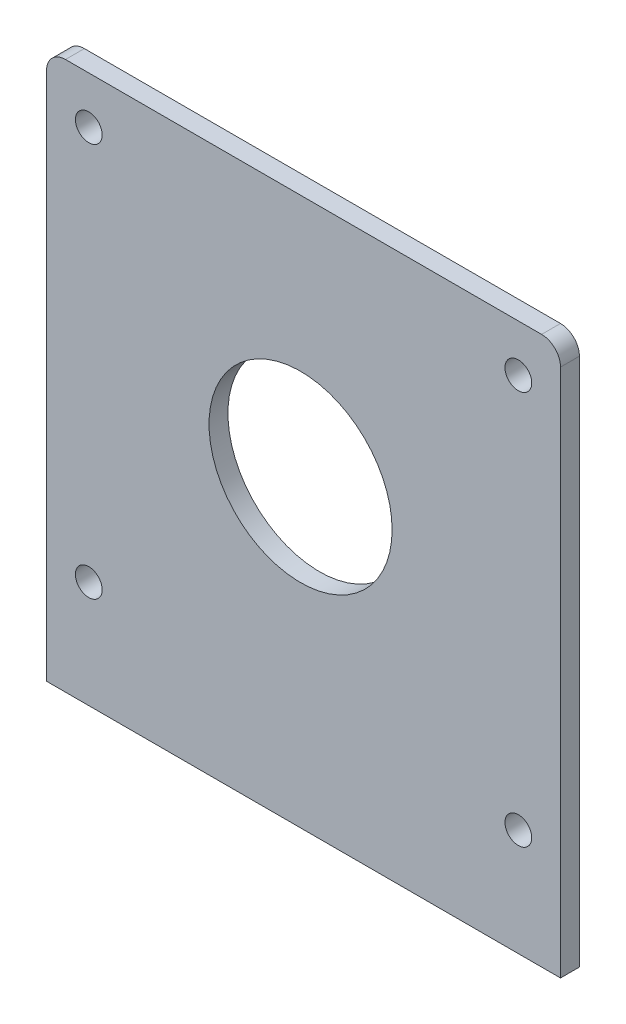
ISO-10303-21;
HEADER;
FILE_DESCRIPTION(('STEP AP214'),'2;1');
FILE_NAME('part.step','',(''),(''),'','','');
FILE_SCHEMA(('AUTOMOTIVE_DESIGN { 1 0 10303 214 1 1 1 1 }'));
ENDSEC;
DATA;
#1=APPLICATION_CONTEXT('core data for automotive mechanical design processes');
#2=APPLICATION_PROTOCOL_DEFINITION('international standard','automotive_design',2000,#1);
#3=PRODUCT_CONTEXT('',#1,'mechanical');
#4=PRODUCT('Part','Part','',(#3));
#5=PRODUCT_RELATED_PRODUCT_CATEGORY('part','',(#4));
#6=PRODUCT_DEFINITION_FORMATION('','',#4);
#7=PRODUCT_DEFINITION_CONTEXT('part definition',#1,'design');
#8=PRODUCT_DEFINITION('design','',#6,#7);
#9=PRODUCT_DEFINITION_SHAPE('','',#8);
#10=(LENGTH_UNIT() NAMED_UNIT(*) SI_UNIT(.MILLI.,.METRE.));
#11=(NAMED_UNIT(*) PLANE_ANGLE_UNIT() SI_UNIT($,.RADIAN.));
#12=(NAMED_UNIT(*) SI_UNIT($,.STERADIAN.) SOLID_ANGLE_UNIT());
#13=UNCERTAINTY_MEASURE_WITH_UNIT(LENGTH_MEASURE(1.E-05),#10,'distance_accuracy_value','');
#14=(GEOMETRIC_REPRESENTATION_CONTEXT(3) GLOBAL_UNCERTAINTY_ASSIGNED_CONTEXT((#13)) GLOBAL_UNIT_ASSIGNED_CONTEXT((#10,
#11,#12)) REPRESENTATION_CONTEXT('',''));
#15=CARTESIAN_POINT('',(0.,0.,0.));
#16=DIRECTION('',(0.,0.,1.));
#17=DIRECTION('',(1.,0.,0.));
#18=AXIS2_PLACEMENT_3D('',#15,#16,#17);
#19=CARTESIAN_POINT('',(43.18,-42.8625,1.5875));
#20=DIRECTION('',(-1.,0.,0.));
#21=DIRECTION('',(0.,0.,1.));
#22=AXIS2_PLACEMENT_3D('',#19,#20,#21);
#23=PLANE('',#22);
#24=DIRECTION('',(0.,1.,0.));
#25=VECTOR('',#24,1.);
#26=CARTESIAN_POINT('',(43.18,-42.8625,-1.5875));
#27=LINE('',#26,#25);
#28=CARTESIAN_POINT('',(43.18,-49.2125,-1.5875));
#29=VERTEX_POINT('',#28);
#30=CARTESIAN_POINT('',(43.18,39.6875,-1.5875));
#31=VERTEX_POINT('',#30);
#32=EDGE_CURVE('E113',#29,#31,#27,.T.);
#33=ORIENTED_EDGE('',*,*,#32,.T.);
#34=DIRECTION('',(0.,0.,-1.));
#35=VECTOR('',#34,1.);
#36=CARTESIAN_POINT('',(43.18,39.6875,1.5875));
#37=LINE('',#36,#35);
#38=CARTESIAN_POINT('',(43.18,39.6875,1.5875));
#39=VERTEX_POINT('',#38);
#40=EDGE_CURVE('E11',#31,#39,#37,.F.);
#41=ORIENTED_EDGE('',*,*,#40,.T.);
#42=DIRECTION('',(0.,1.,0.));
#43=VECTOR('',#42,1.);
#44=CARTESIAN_POINT('',(43.18,-42.8625,1.5875));
#45=LINE('',#44,#43);
#46=CARTESIAN_POINT('',(43.18,-49.2125,1.5875));
#47=VERTEX_POINT('',#46);
#48=EDGE_CURVE('E100',#47,#39,#45,.T.);
#49=ORIENTED_EDGE('',*,*,#48,.F.);
#50=DIRECTION('',(0.,0.,1.));
#51=VECTOR('',#50,1.);
#52=CARTESIAN_POINT('',(43.18,-49.2125,-1.5875));
#53=LINE('',#52,#51);
#54=EDGE_CURVE('E110',#29,#47,#53,.T.);
#55=ORIENTED_EDGE('',*,*,#54,.F.);
#56=EDGE_LOOP('',(#33,#41,#49,#55));
#57=FACE_BOUND('',#56,.T.);
#58=ADVANCED_FACE('F35',(#57),#23,.F.);
#59=CARTESIAN_POINT('',(43.18,42.8625,1.5875));
#60=DIRECTION('',(0.,-1.,0.));
#61=DIRECTION('',(0.,0.,-1.));
#62=AXIS2_PLACEMENT_3D('',#59,#60,#61);
#63=PLANE('',#62);
#64=DIRECTION('',(-1.,0.,0.));
#65=VECTOR('',#64,1.);
#66=CARTESIAN_POINT('',(43.18,42.8625,-1.5875));
#67=LINE('',#66,#65);
#68=CARTESIAN_POINT('',(40.005,42.8625,-1.5875));
#69=VERTEX_POINT('',#68);
#70=CARTESIAN_POINT('',(-40.005,42.8625,-1.5875));
#71=VERTEX_POINT('',#70);
#72=EDGE_CURVE('E101',#69,#71,#67,.T.);
#73=ORIENTED_EDGE('',*,*,#72,.T.);
#74=DIRECTION('',(0.,0.,-1.));
#75=VECTOR('',#74,1.);
#76=CARTESIAN_POINT('',(-40.005,42.8625,1.5875));
#77=LINE('',#76,#75);
#78=CARTESIAN_POINT('',(-40.005,42.8625,1.5875));
#79=VERTEX_POINT('',#78);
#80=EDGE_CURVE('E56',#71,#79,#77,.F.);
#81=ORIENTED_EDGE('',*,*,#80,.T.);
#82=DIRECTION('',(-1.,0.,0.));
#83=VECTOR('',#82,1.);
#84=CARTESIAN_POINT('',(43.18,42.8625,1.5875));
#85=LINE('',#84,#83);
#86=CARTESIAN_POINT('',(40.005,42.8625,1.5875));
#87=VERTEX_POINT('',#86);
#88=EDGE_CURVE('E150',#87,#79,#85,.T.);
#89=ORIENTED_EDGE('',*,*,#88,.F.);
#90=DIRECTION('',(0.,0.,-1.));
#91=VECTOR('',#90,1.);
#92=CARTESIAN_POINT('',(40.005,42.8625,1.5875));
#93=LINE('',#92,#91);
#94=EDGE_CURVE('E161',#87,#69,#93,.T.);
#95=ORIENTED_EDGE('',*,*,#94,.T.);
#96=EDGE_LOOP('',(#73,#81,#89,#95));
#97=FACE_BOUND('',#96,.T.);
#98=ADVANCED_FACE('F172',(#97),#63,.F.);
#99=CARTESIAN_POINT('',(-43.18,42.8625,1.5875));
#100=DIRECTION('',(1.,0.,0.));
#101=DIRECTION('',(0.,0.,-1.));
#102=AXIS2_PLACEMENT_3D('',#99,#100,#101);
#103=PLANE('',#102);
#104=DIRECTION('',(0.,-1.,0.));
#105=VECTOR('',#104,1.);
#106=CARTESIAN_POINT('',(-43.18,42.8625,1.5875));
#107=LINE('',#106,#105);
#108=CARTESIAN_POINT('',(-43.18,39.6875,1.5875));
#109=VERTEX_POINT('',#108);
#110=CARTESIAN_POINT('',(-43.18,-49.2125,1.5875));
#111=VERTEX_POINT('',#110);
#112=EDGE_CURVE('E152',#109,#111,#107,.T.);
#113=ORIENTED_EDGE('',*,*,#112,.F.);
#114=DIRECTION('',(0.,0.,-1.));
#115=VECTOR('',#114,1.);
#116=CARTESIAN_POINT('',(-43.18,39.6875,1.5875));
#117=LINE('',#116,#115);
#118=CARTESIAN_POINT('',(-43.18,39.6875,-1.5875));
#119=VERTEX_POINT('',#118);
#120=EDGE_CURVE('E97',#109,#119,#117,.T.);
#121=ORIENTED_EDGE('',*,*,#120,.T.);
#122=DIRECTION('',(0.,-1.,0.));
#123=VECTOR('',#122,1.);
#124=CARTESIAN_POINT('',(-43.18,42.8625,-1.5875));
#125=LINE('',#124,#123);
#126=CARTESIAN_POINT('',(-43.18,-49.2125,-1.5875));
#127=VERTEX_POINT('',#126);
#128=EDGE_CURVE('E90',#119,#127,#125,.T.);
#129=ORIENTED_EDGE('',*,*,#128,.T.);
#130=DIRECTION('',(0.,0.,1.));
#131=VECTOR('',#130,1.);
#132=CARTESIAN_POINT('',(-43.18,-49.2125,-1.5875));
#133=LINE('',#132,#131);
#134=EDGE_CURVE('E94',#127,#111,#133,.T.);
#135=ORIENTED_EDGE('',*,*,#134,.T.);
#136=EDGE_LOOP('',(#113,#121,#129,#135));
#137=FACE_BOUND('',#136,.T.);
#138=ADVANCED_FACE('F93',(#137),#103,.F.);
#139=CARTESIAN_POINT('',(0.,0.,1.5875));
#140=DIRECTION('',(0.,0.,1.));
#141=DIRECTION('',(1.,0.,0.));
#142=AXIS2_PLACEMENT_3D('',#139,#140,#141);
#143=PLANE('',#142);
#144=CARTESIAN_POINT('',(36.0913702497801,34.9538702497801,1.5875));
#145=DIRECTION('',(0.,0.,1.));
#146=DIRECTION('',(1.,0.,0.));
#147=AXIS2_PLACEMENT_3D('',#144,#145,#146);
#148=CIRCLE('',#147,2.25);
#149=CARTESIAN_POINT('',(38.3413702497801,34.9538702497801,1.5875));
#150=VERTEX_POINT('',#149);
#151=EDGE_CURVE('E118',#150,#150,#148,.T.);
#152=ORIENTED_EDGE('',*,*,#151,.F.);
#153=EDGE_LOOP('',(#152));
#154=FACE_BOUND('',#153,.T.);
#155=CARTESIAN_POINT('',(36.0913702497801,-31.2288702497802,1.5875));
#156=DIRECTION('',(0.,0.,1.));
#157=DIRECTION('',(1.,0.,0.));
#158=AXIS2_PLACEMENT_3D('',#155,#156,#157);
#159=CIRCLE('',#158,2.25);
#160=CARTESIAN_POINT('',(38.3413702497801,-31.2288702497802,1.5875));
#161=VERTEX_POINT('',#160);
#162=EDGE_CURVE('E125',#161,#161,#159,.T.);
#163=ORIENTED_EDGE('',*,*,#162,.F.);
#164=EDGE_LOOP('',(#163));
#165=FACE_BOUND('',#164,.T.);
#166=CARTESIAN_POINT('',(-36.0913702497801,34.9538702497801,1.5875));
#167=DIRECTION('',(0.,0.,1.));
#168=DIRECTION('',(1.,0.,0.));
#169=AXIS2_PLACEMENT_3D('',#166,#167,#168);
#170=CIRCLE('',#169,2.25);
#171=CARTESIAN_POINT('',(-33.8413702497801,34.9538702497801,1.5875));
#172=VERTEX_POINT('',#171);
#173=EDGE_CURVE('E131',#172,#172,#170,.T.);
#174=ORIENTED_EDGE('',*,*,#173,.F.);
#175=EDGE_LOOP('',(#174));
#176=FACE_BOUND('',#175,.T.);
#177=CARTESIAN_POINT('',(-36.0913702497801,-31.2288702497802,1.5875));
#178=DIRECTION('',(0.,0.,1.));
#179=DIRECTION('',(1.,0.,0.));
#180=AXIS2_PLACEMENT_3D('',#177,#178,#179);
#181=CIRCLE('',#180,2.25);
#182=CARTESIAN_POINT('',(-33.8413702497801,-31.2288702497802,1.5875));
#183=VERTEX_POINT('',#182);
#184=EDGE_CURVE('E137',#183,#183,#181,.T.);
#185=ORIENTED_EDGE('',*,*,#184,.F.);
#186=EDGE_LOOP('',(#185));
#187=FACE_BOUND('',#186,.T.);
#188=CARTESIAN_POINT('',(-0.500000000000008,1.86249999999999,1.5875));
#189=DIRECTION('',(0.,0.,1.));
#190=DIRECTION('',(1.,0.,0.));
#191=AXIS2_PLACEMENT_3D('',#188,#189,#190);
#192=CIRCLE('',#191,15.380999972);
#193=CARTESIAN_POINT('',(14.880999972,1.86249999999999,1.5875));
#194=VERTEX_POINT('',#193);
#195=EDGE_CURVE('E143',#194,#194,#192,.T.);
#196=ORIENTED_EDGE('',*,*,#195,.F.);
#197=EDGE_LOOP('',(#196));
#198=FACE_BOUND('',#197,.T.);
#199=ORIENTED_EDGE('',*,*,#88,.T.);
#200=CARTESIAN_POINT('',(-40.005,39.6875,1.5875));
#201=DIRECTION('',(0.,0.,1.));
#202=DIRECTION('',(1.,0.,0.));
#203=AXIS2_PLACEMENT_3D('',#200,#201,#202);
#204=CIRCLE('',#203,3.175);
#205=EDGE_CURVE('E43',#79,#109,#204,.T.);
#206=ORIENTED_EDGE('',*,*,#205,.T.);
#207=ORIENTED_EDGE('',*,*,#112,.T.);
#208=DIRECTION('',(1.,0.,0.));
#209=VECTOR('',#208,1.);
#210=CARTESIAN_POINT('',(43.18,-49.2125,1.5875));
#211=LINE('',#210,#209);
#212=EDGE_CURVE('E109',#111,#47,#211,.T.);
#213=ORIENTED_EDGE('',*,*,#212,.T.);
#214=ORIENTED_EDGE('',*,*,#48,.T.);
#215=CARTESIAN_POINT('',(40.005,39.6875,1.5875));
#216=DIRECTION('',(0.,0.,1.));
#217=DIRECTION('',(1.,0.,0.));
#218=AXIS2_PLACEMENT_3D('',#215,#216,#217);
#219=CIRCLE('',#218,3.175);
#220=EDGE_CURVE('E165',#39,#87,#219,.T.);
#221=ORIENTED_EDGE('',*,*,#220,.T.);
#222=EDGE_LOOP('',(#199,#206,#207,#213,#214,#221));
#223=FACE_BOUND('',#222,.T.);
#224=ADVANCED_FACE('F168',(#154,#165,#176,#187,#198,#223),#143,.T.);
#225=CARTESIAN_POINT('',(0.,0.,-1.5875));
#226=DIRECTION('',(0.,0.,1.));
#227=DIRECTION('',(1.,0.,0.));
#228=AXIS2_PLACEMENT_3D('',#225,#226,#227);
#229=PLANE('',#228);
#230=CARTESIAN_POINT('',(36.0913702497801,34.9538702497801,-1.5875));
#231=DIRECTION('',(0.,0.,1.));
#232=DIRECTION('',(1.,0.,0.));
#233=AXIS2_PLACEMENT_3D('',#230,#231,#232);
#234=CIRCLE('',#233,2.25);
#235=CARTESIAN_POINT('',(38.3413702497801,34.9538702497801,-1.5875));
#236=VERTEX_POINT('',#235);
#237=EDGE_CURVE('E122',#236,#236,#234,.T.);
#238=ORIENTED_EDGE('',*,*,#237,.T.);
#239=EDGE_LOOP('',(#238));
#240=FACE_BOUND('',#239,.T.);
#241=CARTESIAN_POINT('',(36.0913702497801,-31.2288702497802,-1.5875));
#242=DIRECTION('',(0.,0.,1.));
#243=DIRECTION('',(1.,0.,0.));
#244=AXIS2_PLACEMENT_3D('',#241,#242,#243);
#245=CIRCLE('',#244,2.25);
#246=CARTESIAN_POINT('',(38.3413702497801,-31.2288702497802,-1.5875));
#247=VERTEX_POINT('',#246);
#248=EDGE_CURVE('E128',#247,#247,#245,.T.);
#249=ORIENTED_EDGE('',*,*,#248,.T.);
#250=EDGE_LOOP('',(#249));
#251=FACE_BOUND('',#250,.T.);
#252=CARTESIAN_POINT('',(-36.0913702497801,34.9538702497801,-1.5875));
#253=DIRECTION('',(0.,0.,1.));
#254=DIRECTION('',(1.,0.,0.));
#255=AXIS2_PLACEMENT_3D('',#252,#253,#254);
#256=CIRCLE('',#255,2.25);
#257=CARTESIAN_POINT('',(-33.8413702497801,34.9538702497801,-1.5875));
#258=VERTEX_POINT('',#257);
#259=EDGE_CURVE('E134',#258,#258,#256,.T.);
#260=ORIENTED_EDGE('',*,*,#259,.T.);
#261=EDGE_LOOP('',(#260));
#262=FACE_BOUND('',#261,.T.);
#263=CARTESIAN_POINT('',(-36.0913702497801,-31.2288702497802,-1.5875));
#264=DIRECTION('',(0.,0.,1.));
#265=DIRECTION('',(1.,0.,0.));
#266=AXIS2_PLACEMENT_3D('',#263,#264,#265);
#267=CIRCLE('',#266,2.25);
#268=CARTESIAN_POINT('',(-33.8413702497801,-31.2288702497802,-1.5875));
#269=VERTEX_POINT('',#268);
#270=EDGE_CURVE('E140',#269,#269,#267,.T.);
#271=ORIENTED_EDGE('',*,*,#270,.T.);
#272=EDGE_LOOP('',(#271));
#273=FACE_BOUND('',#272,.T.);
#274=CARTESIAN_POINT('',(-0.500000000000008,1.86249999999999,-1.5875));
#275=DIRECTION('',(0.,0.,1.));
#276=DIRECTION('',(1.,0.,0.));
#277=AXIS2_PLACEMENT_3D('',#274,#275,#276);
#278=CIRCLE('',#277,15.380999972);
#279=CARTESIAN_POINT('',(14.880999972,1.86249999999999,-1.5875));
#280=VERTEX_POINT('',#279);
#281=EDGE_CURVE('E144',#280,#280,#278,.T.);
#282=ORIENTED_EDGE('',*,*,#281,.T.);
#283=EDGE_LOOP('',(#282));
#284=FACE_BOUND('',#283,.T.);
#285=ORIENTED_EDGE('',*,*,#128,.F.);
#286=CARTESIAN_POINT('',(-40.005,39.6875,-1.5875));
#287=DIRECTION('',(0.,0.,1.));
#288=DIRECTION('',(1.,0.,0.));
#289=AXIS2_PLACEMENT_3D('',#286,#287,#288);
#290=CIRCLE('',#289,3.175);
#291=EDGE_CURVE('E159',#119,#71,#290,.F.);
#292=ORIENTED_EDGE('',*,*,#291,.T.);
#293=ORIENTED_EDGE('',*,*,#72,.F.);
#294=CARTESIAN_POINT('',(40.005,39.6875,-1.5875));
#295=DIRECTION('',(0.,0.,1.));
#296=DIRECTION('',(1.,0.,0.));
#297=AXIS2_PLACEMENT_3D('',#294,#295,#296);
#298=CIRCLE('',#297,3.175);
#299=EDGE_CURVE('E157',#69,#31,#298,.F.);
#300=ORIENTED_EDGE('',*,*,#299,.T.);
#301=ORIENTED_EDGE('',*,*,#32,.F.);
#302=DIRECTION('',(1.,0.,0.));
#303=VECTOR('',#302,1.);
#304=CARTESIAN_POINT('',(43.18,-49.2125,-1.5875));
#305=LINE('',#304,#303);
#306=EDGE_CURVE('E107',#127,#29,#305,.T.);
#307=ORIENTED_EDGE('',*,*,#306,.F.);
#308=EDGE_LOOP('',(#285,#292,#293,#300,#301,#307));
#309=FACE_BOUND('',#308,.T.);
#310=ADVANCED_FACE('F112',(#240,#251,#262,#273,#284,#309),#229,.F.);
#311=CARTESIAN_POINT('',(-0.500000000000008,1.86249999999999,-1.5875));
#312=DIRECTION('',(0.,0.,1.));
#313=DIRECTION('',(1.,0.,0.));
#314=AXIS2_PLACEMENT_3D('',#311,#312,#313);
#315=CYLINDRICAL_SURFACE('',#314,15.380999972);
#316=ORIENTED_EDGE('',*,*,#281,.F.);
#317=EDGE_LOOP('',(#316));
#318=FACE_BOUND('',#317,.T.);
#319=ORIENTED_EDGE('',*,*,#195,.T.);
#320=EDGE_LOOP('',(#319));
#321=FACE_BOUND('',#320,.T.);
#322=ADVANCED_FACE('F207',(#318,#321),#315,.F.);
#323=CARTESIAN_POINT('',(-36.0913702497801,-31.2288702497802,1.5875));
#324=DIRECTION('',(0.,0.,1.));
#325=DIRECTION('',(1.,0.,0.));
#326=AXIS2_PLACEMENT_3D('',#323,#324,#325);
#327=CYLINDRICAL_SURFACE('',#326,2.25);
#328=ORIENTED_EDGE('',*,*,#270,.F.);
#329=EDGE_LOOP('',(#328));
#330=FACE_BOUND('',#329,.T.);
#331=ORIENTED_EDGE('',*,*,#184,.T.);
#332=EDGE_LOOP('',(#331));
#333=FACE_BOUND('',#332,.T.);
#334=ADVANCED_FACE('F203',(#330,#333),#327,.F.);
#335=CARTESIAN_POINT('',(-36.0913702497801,34.9538702497801,1.5875));
#336=DIRECTION('',(0.,0.,1.));
#337=DIRECTION('',(1.,0.,0.));
#338=AXIS2_PLACEMENT_3D('',#335,#336,#337);
#339=CYLINDRICAL_SURFACE('',#338,2.25);
#340=ORIENTED_EDGE('',*,*,#259,.F.);
#341=EDGE_LOOP('',(#340));
#342=FACE_BOUND('',#341,.T.);
#343=ORIENTED_EDGE('',*,*,#173,.T.);
#344=EDGE_LOOP('',(#343));
#345=FACE_BOUND('',#344,.T.);
#346=ADVANCED_FACE('F199',(#342,#345),#339,.F.);
#347=CARTESIAN_POINT('',(36.0913702497801,-31.2288702497802,1.5875));
#348=DIRECTION('',(0.,0.,1.));
#349=DIRECTION('',(1.,0.,0.));
#350=AXIS2_PLACEMENT_3D('',#347,#348,#349);
#351=CYLINDRICAL_SURFACE('',#350,2.25);
#352=ORIENTED_EDGE('',*,*,#248,.F.);
#353=EDGE_LOOP('',(#352));
#354=FACE_BOUND('',#353,.T.);
#355=ORIENTED_EDGE('',*,*,#162,.T.);
#356=EDGE_LOOP('',(#355));
#357=FACE_BOUND('',#356,.T.);
#358=ADVANCED_FACE('F193',(#354,#357),#351,.F.);
#359=CARTESIAN_POINT('',(36.0913702497801,34.9538702497801,1.5875));
#360=DIRECTION('',(0.,0.,1.));
#361=DIRECTION('',(1.,0.,0.));
#362=AXIS2_PLACEMENT_3D('',#359,#360,#361);
#363=CYLINDRICAL_SURFACE('',#362,2.25);
#364=ORIENTED_EDGE('',*,*,#237,.F.);
#365=EDGE_LOOP('',(#364));
#366=FACE_BOUND('',#365,.T.);
#367=ORIENTED_EDGE('',*,*,#151,.T.);
#368=EDGE_LOOP('',(#367));
#369=FACE_BOUND('',#368,.T.);
#370=ADVANCED_FACE('F188',(#366,#369),#363,.F.);
#371=CARTESIAN_POINT('',(43.18,-49.2125,-1.5875));
#372=DIRECTION('',(0.,-1.,0.));
#373=DIRECTION('',(1.,0.,0.));
#374=AXIS2_PLACEMENT_3D('',#371,#372,#373);
#375=PLANE('',#374);
#376=ORIENTED_EDGE('',*,*,#212,.F.);
#377=ORIENTED_EDGE('',*,*,#134,.F.);
#378=ORIENTED_EDGE('',*,*,#306,.T.);
#379=ORIENTED_EDGE('',*,*,#54,.T.);
#380=EDGE_LOOP('',(#376,#377,#378,#379));
#381=FACE_BOUND('',#380,.T.);
#382=ADVANCED_FACE('F105',(#381),#375,.T.);
#383=CARTESIAN_POINT('',(-40.005,39.6875,1.5875));
#384=DIRECTION('',(0.,0.,-1.));
#385=DIRECTION('',(-1.,0.,0.));
#386=AXIS2_PLACEMENT_3D('',#383,#384,#385);
#387=CYLINDRICAL_SURFACE('',#386,3.175);
#388=ORIENTED_EDGE('',*,*,#205,.F.);
#389=ORIENTED_EDGE('',*,*,#80,.F.);
#390=ORIENTED_EDGE('',*,*,#291,.F.);
#391=ORIENTED_EDGE('',*,*,#120,.F.);
#392=EDGE_LOOP('',(#388,#389,#390,#391));
#393=FACE_BOUND('',#392,.T.);
#394=ADVANCED_FACE('F170',(#393),#387,.T.);
#395=CARTESIAN_POINT('',(40.005,39.6875,1.5875));
#396=DIRECTION('',(0.,0.,-1.));
#397=DIRECTION('',(-1.,0.,0.));
#398=AXIS2_PLACEMENT_3D('',#395,#396,#397);
#399=CYLINDRICAL_SURFACE('',#398,3.175);
#400=ORIENTED_EDGE('',*,*,#220,.F.);
#401=ORIENTED_EDGE('',*,*,#40,.F.);
#402=ORIENTED_EDGE('',*,*,#299,.F.);
#403=ORIENTED_EDGE('',*,*,#94,.F.);
#404=EDGE_LOOP('',(#400,#401,#402,#403));
#405=FACE_BOUND('',#404,.T.);
#406=ADVANCED_FACE('F37',(#405),#399,.T.);
#407=CLOSED_SHELL('',(#58,#98,#138,#224,#310,#322,#334,#346,#358,#370,#382,#394,#406));
#408=MANIFOLD_SOLID_BREP('B2',#407);
#409=ADVANCED_BREP_SHAPE_REPRESENTATION('',(#18,#408),#14);
#410=SHAPE_DEFINITION_REPRESENTATION(#9,#409);
ENDSEC;
END-ISO-10303-21;
